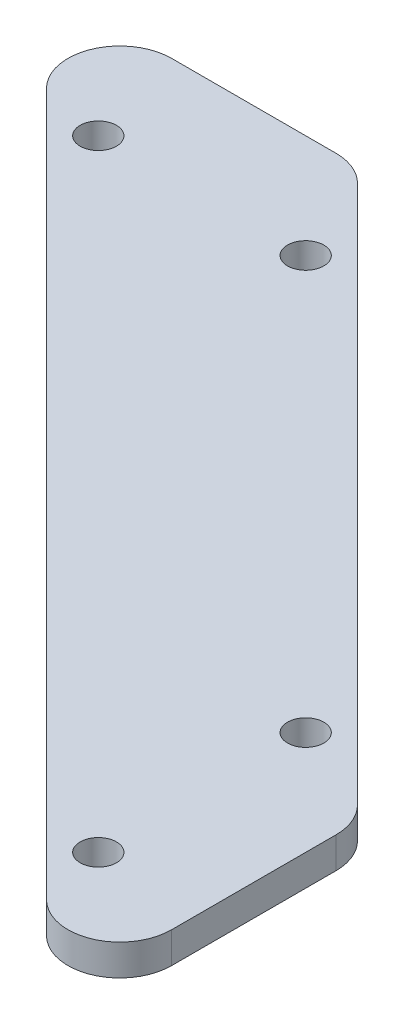
ISO-10303-21;
HEADER;
FILE_DESCRIPTION(('STEP AP214'),'2;1');
FILE_NAME('part.step','',(''),(''),'','','');
FILE_SCHEMA(('AUTOMOTIVE_DESIGN { 1 0 10303 214 1 1 1 1 }'));
ENDSEC;
DATA;
#1=APPLICATION_CONTEXT('core data for automotive mechanical design processes');
#2=APPLICATION_PROTOCOL_DEFINITION('international standard','automotive_design',2000,#1);
#3=PRODUCT_CONTEXT('',#1,'mechanical');
#4=PRODUCT('Part','Part','',(#3));
#5=PRODUCT_RELATED_PRODUCT_CATEGORY('part','',(#4));
#6=PRODUCT_DEFINITION_FORMATION('','',#4);
#7=PRODUCT_DEFINITION_CONTEXT('part definition',#1,'design');
#8=PRODUCT_DEFINITION('design','',#6,#7);
#9=PRODUCT_DEFINITION_SHAPE('','',#8);
#10=(LENGTH_UNIT() NAMED_UNIT(*) SI_UNIT(.MILLI.,.METRE.));
#11=(NAMED_UNIT(*) PLANE_ANGLE_UNIT() SI_UNIT($,.RADIAN.));
#12=(NAMED_UNIT(*) SI_UNIT($,.STERADIAN.) SOLID_ANGLE_UNIT());
#13=UNCERTAINTY_MEASURE_WITH_UNIT(LENGTH_MEASURE(1.E-05),#10,'distance_accuracy_value','');
#14=(GEOMETRIC_REPRESENTATION_CONTEXT(3) GLOBAL_UNCERTAINTY_ASSIGNED_CONTEXT((#13)) GLOBAL_UNIT_ASSIGNED_CONTEXT((#10,
#11,#12)) REPRESENTATION_CONTEXT('',''));
#15=CARTESIAN_POINT('',(0.,0.,0.));
#16=DIRECTION('',(0.,0.,1.));
#17=DIRECTION('',(1.,0.,0.));
#18=AXIS2_PLACEMENT_3D('',#15,#16,#17);
#19=CARTESIAN_POINT('',(0.,3.,-29.9999999999997));
#20=DIRECTION('',(-1.,0.,0.));
#21=DIRECTION('',(0.,0.,1.));
#22=AXIS2_PLACEMENT_3D('',#19,#20,#21);
#23=PLANE('',#22);
#24=DIRECTION('',(0.,0.,-1.));
#25=VECTOR('',#24,1.);
#26=CARTESIAN_POINT('',(0.,3.,-29.9999999999997));
#27=LINE('',#26,#25);
#28=CARTESIAN_POINT('',(0.,3.,-12.0710678118654));
#29=VERTEX_POINT('',#28);
#30=CARTESIAN_POINT('',(0.,3.,-27.9289321881342));
#31=VERTEX_POINT('',#30);
#32=EDGE_CURVE('E117',#29,#31,#27,.T.);
#33=ORIENTED_EDGE('',*,*,#32,.F.);
#34=DIRECTION('',(0.,-1.,0.));
#35=VECTOR('',#34,1.);
#36=CARTESIAN_POINT('',(0.,3.,-12.0710678118654));
#37=LINE('',#36,#35);
#38=CARTESIAN_POINT('',(0.,0.,-12.0710678118654));
#39=VERTEX_POINT('',#38);
#40=EDGE_CURVE('E102',#29,#39,#37,.T.);
#41=ORIENTED_EDGE('',*,*,#40,.T.);
#42=DIRECTION('',(0.,0.,-1.));
#43=VECTOR('',#42,1.);
#44=CARTESIAN_POINT('',(0.,0.,-29.9999999999997));
#45=LINE('',#44,#43);
#46=CARTESIAN_POINT('',(0.,0.,-27.9289321881342));
#47=VERTEX_POINT('',#46);
#48=EDGE_CURVE('E114',#39,#47,#45,.T.);
#49=ORIENTED_EDGE('',*,*,#48,.T.);
#50=DIRECTION('',(0.,-1.,0.));
#51=VECTOR('',#50,1.);
#52=CARTESIAN_POINT('',(0.,3.,-27.9289321881342));
#53=LINE('',#52,#51);
#54=EDGE_CURVE('E119',#47,#31,#53,.F.);
#55=ORIENTED_EDGE('',*,*,#54,.T.);
#56=EDGE_LOOP('',(#33,#41,#49,#55));
#57=FACE_BOUND('',#56,.T.);
#58=ADVANCED_FACE('F32',(#57),#23,.F.);
#59=CARTESIAN_POINT('',(-54.8528137423862,3.,-84.8528137423852));
#60=DIRECTION('',(-0.707106781186543,0.,0.707106781186552));
#61=DIRECTION('',(0.707106781186552,0.,0.707106781186543));
#62=AXIS2_PLACEMENT_3D('',#59,#60,#61);
#63=PLANE('',#62);
#64=DIRECTION('',(-0.707106781186551,0.,-0.707106781186543));
#65=VECTOR('',#64,1.);
#66=CARTESIAN_POINT('',(-54.8528137423862,3.,-84.8528137423852));
#67=LINE('',#66,#65);
#68=CARTESIAN_POINT('',(-1.4644660940673,3.,-31.464466094067));
#69=VERTEX_POINT('',#68);
#70=CARTESIAN_POINT('',(-53.3883476483189,3.,-83.388347648318));
#71=VERTEX_POINT('',#70);
#72=EDGE_CURVE('E163',#69,#71,#67,.T.);
#73=ORIENTED_EDGE('',*,*,#72,.F.);
#74=DIRECTION('',(0.,-1.,0.));
#75=VECTOR('',#74,1.);
#76=CARTESIAN_POINT('',(-1.46446609406729,3.,-31.464466094067));
#77=LINE('',#76,#75);
#78=CARTESIAN_POINT('',(-1.4644660940673,0.,-31.464466094067));
#79=VERTEX_POINT('',#78);
#80=EDGE_CURVE('E156',#69,#79,#77,.T.);
#81=ORIENTED_EDGE('',*,*,#80,.T.);
#82=DIRECTION('',(-0.707106781186551,0.,-0.707106781186543));
#83=VECTOR('',#82,1.);
#84=CARTESIAN_POINT('',(-54.8528137423862,0.,-84.8528137423852));
#85=LINE('',#84,#83);
#86=CARTESIAN_POINT('',(-53.3883476483189,0.,-83.388347648318));
#87=VERTEX_POINT('',#86);
#88=EDGE_CURVE('E123',#79,#87,#85,.T.);
#89=ORIENTED_EDGE('',*,*,#88,.T.);
#90=DIRECTION('',(0.,-1.,0.));
#91=VECTOR('',#90,1.);
#92=CARTESIAN_POINT('',(-53.3883476483189,3.,-83.388347648318));
#93=LINE('',#92,#91);
#94=EDGE_CURVE('E154',#87,#71,#93,.F.);
#95=ORIENTED_EDGE('',*,*,#94,.T.);
#96=EDGE_LOOP('',(#73,#81,#89,#95));
#97=FACE_BOUND('',#96,.T.);
#98=ADVANCED_FACE('F161',(#97),#63,.F.);
#99=CARTESIAN_POINT('',(-84.8528137423861,3.,-84.8528137423852));
#100=DIRECTION('',(0.,0.,1.));
#101=DIRECTION('',(1.,0.,0.));
#102=AXIS2_PLACEMENT_3D('',#99,#100,#101);
#103=PLANE('',#102);
#104=DIRECTION('',(-1.,0.,0.));
#105=VECTOR('',#104,1.);
#106=CARTESIAN_POINT('',(-84.8528137423861,3.,-84.8528137423852));
#107=LINE('',#106,#105);
#108=CARTESIAN_POINT('',(-56.9238815542516,3.,-84.8528137423852));
#109=VERTEX_POINT('',#108);
#110=CARTESIAN_POINT('',(-72.7817459305206,3.,-84.8528137423852));
#111=VERTEX_POINT('',#110);
#112=EDGE_CURVE('E171',#109,#111,#107,.T.);
#113=ORIENTED_EDGE('',*,*,#112,.F.);
#114=DIRECTION('',(0.,-1.,0.));
#115=VECTOR('',#114,1.);
#116=CARTESIAN_POINT('',(-56.9238815542516,3.,-84.8528137423852));
#117=LINE('',#116,#115);
#118=CARTESIAN_POINT('',(-56.9238815542516,0.,-84.8528137423852));
#119=VERTEX_POINT('',#118);
#120=EDGE_CURVE('E11',#109,#119,#117,.T.);
#121=ORIENTED_EDGE('',*,*,#120,.T.);
#122=DIRECTION('',(-1.,0.,0.));
#123=VECTOR('',#122,1.);
#124=CARTESIAN_POINT('',(-84.8528137423861,0.,-84.8528137423852));
#125=LINE('',#124,#123);
#126=CARTESIAN_POINT('',(-72.7817459305206,0.,-84.8528137423852));
#127=VERTEX_POINT('',#126);
#128=EDGE_CURVE('E127',#119,#127,#125,.T.);
#129=ORIENTED_EDGE('',*,*,#128,.T.);
#130=DIRECTION('',(0.,-1.,0.));
#131=VECTOR('',#130,1.);
#132=CARTESIAN_POINT('',(-72.7817459305206,3.,-84.8528137423852));
#133=LINE('',#132,#131);
#134=EDGE_CURVE('E40',#127,#111,#133,.F.);
#135=ORIENTED_EDGE('',*,*,#134,.T.);
#136=EDGE_LOOP('',(#113,#121,#129,#135));
#137=FACE_BOUND('',#136,.T.);
#138=ADVANCED_FACE('F170',(#137),#103,.F.);
#139=CARTESIAN_POINT('',(0.,3.,0.));
#140=DIRECTION('',(0.707106781186544,0.,-0.707106781186551));
#141=DIRECTION('',(-0.707106781186551,0.,-0.707106781186544));
#142=AXIS2_PLACEMENT_3D('',#139,#140,#141);
#143=PLANE('',#142);
#144=DIRECTION('',(0.707106781186551,0.,0.707106781186544));
#145=VECTOR('',#144,1.);
#146=CARTESIAN_POINT('',(0.,0.,0.));
#147=LINE('',#146,#145);
#148=CARTESIAN_POINT('',(-76.3172798364533,0.,-76.3172798364525));
#149=VERTEX_POINT('',#148);
#150=CARTESIAN_POINT('',(-8.53553390593272,0.,-8.53553390593263));
#151=VERTEX_POINT('',#150);
#152=EDGE_CURVE('E137',#149,#151,#147,.T.);
#153=ORIENTED_EDGE('',*,*,#152,.T.);
#154=DIRECTION('',(0.,-1.,0.));
#155=VECTOR('',#154,1.);
#156=CARTESIAN_POINT('',(-8.53553390593272,3.,-8.53553390593263));
#157=LINE('',#156,#155);
#158=CARTESIAN_POINT('',(-8.53553390593272,3.,-8.53553390593263));
#159=VERTEX_POINT('',#158);
#160=EDGE_CURVE('E103',#151,#159,#157,.F.);
#161=ORIENTED_EDGE('',*,*,#160,.T.);
#162=DIRECTION('',(0.707106781186551,0.,0.707106781186544));
#163=VECTOR('',#162,1.);
#164=CARTESIAN_POINT('',(0.,3.,0.));
#165=LINE('',#164,#163);
#166=CARTESIAN_POINT('',(-76.3172798364533,3.,-76.3172798364525));
#167=VERTEX_POINT('',#166);
#168=EDGE_CURVE('E133',#167,#159,#165,.T.);
#169=ORIENTED_EDGE('',*,*,#168,.F.);
#170=DIRECTION('',(0.,-1.,0.));
#171=VECTOR('',#170,1.);
#172=CARTESIAN_POINT('',(-76.3172798364533,3.,-76.3172798364525));
#173=LINE('',#172,#171);
#174=EDGE_CURVE('E108',#167,#149,#173,.T.);
#175=ORIENTED_EDGE('',*,*,#174,.T.);
#176=EDGE_LOOP('',(#153,#161,#169,#175));
#177=FACE_BOUND('',#176,.T.);
#178=ADVANCED_FACE('F203',(#177),#143,.F.);
#179=CARTESIAN_POINT('',(0.,3.,0.));
#180=DIRECTION('',(0.,1.,0.));
#181=DIRECTION('',(0.,0.,1.));
#182=AXIS2_PLACEMENT_3D('',#179,#180,#181);
#183=PLANE('',#182);
#184=CARTESIAN_POINT('',(-69.852813742386,3.,-74.8528137423852));
#185=DIRECTION('',(0.,1.,0.));
#186=DIRECTION('',(0.,0.,1.));
#187=AXIS2_PLACEMENT_3D('',#184,#185,#186);
#188=CIRCLE('',#187,1.74999999999999);
#189=CARTESIAN_POINT('',(-69.852813742386,3.,-73.1028137423853));
#190=VERTEX_POINT('',#189);
#191=EDGE_CURVE('E130',#190,#190,#188,.T.);
#192=ORIENTED_EDGE('',*,*,#191,.F.);
#193=EDGE_LOOP('',(#192));
#194=FACE_BOUND('',#193,.T.);
#195=CARTESIAN_POINT('',(-10.0000000000007,3.,-34.9999999999999));
#196=DIRECTION('',(0.,1.,0.));
#197=DIRECTION('',(0.,0.,1.));
#198=AXIS2_PLACEMENT_3D('',#195,#196,#197);
#199=CIRCLE('',#198,1.75000000000034);
#200=CARTESIAN_POINT('',(-10.0000000000007,3.,-33.2499999999995));
#201=VERTEX_POINT('',#200);
#202=EDGE_CURVE('E190',#201,#201,#199,.T.);
#203=ORIENTED_EDGE('',*,*,#202,.F.);
#204=EDGE_LOOP('',(#203));
#205=FACE_BOUND('',#204,.T.);
#206=CARTESIAN_POINT('',(-10.,3.,-14.9999999999999));
#207=DIRECTION('',(0.,1.,0.));
#208=DIRECTION('',(0.,0.,1.));
#209=AXIS2_PLACEMENT_3D('',#206,#207,#208);
#210=CIRCLE('',#209,1.75);
#211=CARTESIAN_POINT('',(-10.,3.,-13.2499999999999));
#212=VERTEX_POINT('',#211);
#213=EDGE_CURVE('E177',#212,#212,#210,.T.);
#214=ORIENTED_EDGE('',*,*,#213,.F.);
#215=EDGE_LOOP('',(#214));
#216=FACE_BOUND('',#215,.T.);
#217=CARTESIAN_POINT('',(-49.852813742386,3.,-74.8528137423852));
#218=DIRECTION('',(0.,1.,0.));
#219=DIRECTION('',(0.,0.,1.));
#220=AXIS2_PLACEMENT_3D('',#217,#218,#219);
#221=CIRCLE('',#220,1.75);
#222=CARTESIAN_POINT('',(-49.852813742386,3.,-73.1028137423852));
#223=VERTEX_POINT('',#222);
#224=EDGE_CURVE('E184',#223,#223,#221,.T.);
#225=ORIENTED_EDGE('',*,*,#224,.F.);
#226=EDGE_LOOP('',(#225));
#227=FACE_BOUND('',#226,.T.);
#228=ORIENTED_EDGE('',*,*,#168,.T.);
#229=CARTESIAN_POINT('',(-5.,3.,-12.0710678118654));
#230=DIRECTION('',(0.,1.,0.));
#231=DIRECTION('',(0.,0.,1.));
#232=AXIS2_PLACEMENT_3D('',#229,#230,#231);
#233=CIRCLE('',#232,5.);
#234=EDGE_CURVE('E152',#159,#29,#233,.T.);
#235=ORIENTED_EDGE('',*,*,#234,.T.);
#236=ORIENTED_EDGE('',*,*,#32,.T.);
#237=CARTESIAN_POINT('',(-5.,3.,-27.9289321881342));
#238=DIRECTION('',(0.,1.,0.));
#239=DIRECTION('',(0.,0.,1.));
#240=AXIS2_PLACEMENT_3D('',#237,#238,#239);
#241=CIRCLE('',#240,5.);
#242=EDGE_CURVE('E150',#31,#69,#241,.T.);
#243=ORIENTED_EDGE('',*,*,#242,.T.);
#244=ORIENTED_EDGE('',*,*,#72,.T.);
#245=CARTESIAN_POINT('',(-56.9238815542516,3.,-79.8528137423852));
#246=DIRECTION('',(0.,1.,0.));
#247=DIRECTION('',(0.,0.,1.));
#248=AXIS2_PLACEMENT_3D('',#245,#246,#247);
#249=CIRCLE('',#248,5.);
#250=EDGE_CURVE('E53',#71,#109,#249,.T.);
#251=ORIENTED_EDGE('',*,*,#250,.T.);
#252=ORIENTED_EDGE('',*,*,#112,.T.);
#253=CARTESIAN_POINT('',(-72.7817459305206,3.,-79.8528137423852));
#254=DIRECTION('',(0.,1.,0.));
#255=DIRECTION('',(0.,0.,1.));
#256=AXIS2_PLACEMENT_3D('',#253,#254,#255);
#257=CIRCLE('',#256,5.);
#258=EDGE_CURVE('E147',#111,#167,#257,.T.);
#259=ORIENTED_EDGE('',*,*,#258,.T.);
#260=EDGE_LOOP('',(#228,#235,#236,#243,#244,#251,#252,#259));
#261=FACE_BOUND('',#260,.T.);
#262=ADVANCED_FACE('F200',(#194,#205,#216,#227,#261),#183,.T.);
#263=CARTESIAN_POINT('',(0.,0.,0.));
#264=DIRECTION('',(0.,1.,0.));
#265=DIRECTION('',(0.,0.,1.));
#266=AXIS2_PLACEMENT_3D('',#263,#264,#265);
#267=PLANE('',#266);
#268=CARTESIAN_POINT('',(-69.852813742386,0.,-74.8528137423852));
#269=DIRECTION('',(0.,1.,0.));
#270=DIRECTION('',(0.,0.,1.));
#271=AXIS2_PLACEMENT_3D('',#268,#269,#270);
#272=CIRCLE('',#271,1.74999999999999);
#273=CARTESIAN_POINT('',(-69.852813742386,0.,-73.1028137423853));
#274=VERTEX_POINT('',#273);
#275=EDGE_CURVE('E124',#274,#274,#272,.T.);
#276=ORIENTED_EDGE('',*,*,#275,.T.);
#277=EDGE_LOOP('',(#276));
#278=FACE_BOUND('',#277,.T.);
#279=CARTESIAN_POINT('',(-10.0000000000007,0.,-34.9999999999999));
#280=DIRECTION('',(0.,1.,0.));
#281=DIRECTION('',(0.,0.,1.));
#282=AXIS2_PLACEMENT_3D('',#279,#280,#281);
#283=CIRCLE('',#282,1.75000000000034);
#284=CARTESIAN_POINT('',(-10.0000000000007,0.,-33.2499999999995));
#285=VERTEX_POINT('',#284);
#286=EDGE_CURVE('E181',#285,#285,#283,.T.);
#287=ORIENTED_EDGE('',*,*,#286,.T.);
#288=EDGE_LOOP('',(#287));
#289=FACE_BOUND('',#288,.T.);
#290=CARTESIAN_POINT('',(-10.,0.,-14.9999999999999));
#291=DIRECTION('',(0.,1.,0.));
#292=DIRECTION('',(0.,0.,1.));
#293=AXIS2_PLACEMENT_3D('',#290,#291,#292);
#294=CIRCLE('',#293,1.75);
#295=CARTESIAN_POINT('',(-10.,0.,-13.2499999999999));
#296=VERTEX_POINT('',#295);
#297=EDGE_CURVE('E180',#296,#296,#294,.T.);
#298=ORIENTED_EDGE('',*,*,#297,.T.);
#299=EDGE_LOOP('',(#298));
#300=FACE_BOUND('',#299,.T.);
#301=CARTESIAN_POINT('',(-49.852813742386,0.,-74.8528137423852));
#302=DIRECTION('',(0.,1.,0.));
#303=DIRECTION('',(0.,0.,1.));
#304=AXIS2_PLACEMENT_3D('',#301,#302,#303);
#305=CIRCLE('',#304,1.75);
#306=CARTESIAN_POINT('',(-49.852813742386,0.,-73.1028137423852));
#307=VERTEX_POINT('',#306);
#308=EDGE_CURVE('E187',#307,#307,#305,.T.);
#309=ORIENTED_EDGE('',*,*,#308,.T.);
#310=EDGE_LOOP('',(#309));
#311=FACE_BOUND('',#310,.T.);
#312=ORIENTED_EDGE('',*,*,#48,.F.);
#313=CARTESIAN_POINT('',(-5.,0.,-12.0710678118654));
#314=DIRECTION('',(0.,1.,0.));
#315=DIRECTION('',(0.,0.,1.));
#316=AXIS2_PLACEMENT_3D('',#313,#314,#315);
#317=CIRCLE('',#316,5.);
#318=EDGE_CURVE('E98',#39,#151,#317,.F.);
#319=ORIENTED_EDGE('',*,*,#318,.T.);
#320=ORIENTED_EDGE('',*,*,#152,.F.);
#321=CARTESIAN_POINT('',(-72.7817459305206,0.,-79.8528137423852));
#322=DIRECTION('',(0.,1.,0.));
#323=DIRECTION('',(0.,0.,1.));
#324=AXIS2_PLACEMENT_3D('',#321,#322,#323);
#325=CIRCLE('',#324,5.);
#326=EDGE_CURVE('E118',#149,#127,#325,.F.);
#327=ORIENTED_EDGE('',*,*,#326,.T.);
#328=ORIENTED_EDGE('',*,*,#128,.F.);
#329=CARTESIAN_POINT('',(-56.9238815542516,0.,-79.8528137423852));
#330=DIRECTION('',(0.,1.,0.));
#331=DIRECTION('',(0.,0.,1.));
#332=AXIS2_PLACEMENT_3D('',#329,#330,#331);
#333=CIRCLE('',#332,5.);
#334=EDGE_CURVE('E141',#119,#87,#333,.F.);
#335=ORIENTED_EDGE('',*,*,#334,.T.);
#336=ORIENTED_EDGE('',*,*,#88,.F.);
#337=CARTESIAN_POINT('',(-5.,0.,-27.9289321881342));
#338=DIRECTION('',(0.,1.,0.));
#339=DIRECTION('',(0.,0.,1.));
#340=AXIS2_PLACEMENT_3D('',#337,#338,#339);
#341=CIRCLE('',#340,5.);
#342=EDGE_CURVE('E109',#79,#47,#341,.F.);
#343=ORIENTED_EDGE('',*,*,#342,.T.);
#344=EDGE_LOOP('',(#312,#319,#320,#327,#328,#335,#336,#343));
#345=FACE_BOUND('',#344,.T.);
#346=ADVANCED_FACE('F121',(#278,#289,#300,#311,#345),#267,.F.);
#347=CARTESIAN_POINT('',(-49.852813742386,0.,-74.8528137423852));
#348=DIRECTION('',(0.,1.,0.));
#349=DIRECTION('',(0.,0.,1.));
#350=AXIS2_PLACEMENT_3D('',#347,#348,#349);
#351=CYLINDRICAL_SURFACE('',#350,1.75);
#352=ORIENTED_EDGE('',*,*,#308,.F.);
#353=EDGE_LOOP('',(#352));
#354=FACE_BOUND('',#353,.T.);
#355=ORIENTED_EDGE('',*,*,#224,.T.);
#356=EDGE_LOOP('',(#355));
#357=FACE_BOUND('',#356,.T.);
#358=ADVANCED_FACE('F277',(#354,#357),#351,.F.);
#359=CARTESIAN_POINT('',(-10.,0.,-14.9999999999999));
#360=DIRECTION('',(0.,1.,0.));
#361=DIRECTION('',(0.,0.,1.));
#362=AXIS2_PLACEMENT_3D('',#359,#360,#361);
#363=CYLINDRICAL_SURFACE('',#362,1.75);
#364=ORIENTED_EDGE('',*,*,#297,.F.);
#365=EDGE_LOOP('',(#364));
#366=FACE_BOUND('',#365,.T.);
#367=ORIENTED_EDGE('',*,*,#213,.T.);
#368=EDGE_LOOP('',(#367));
#369=FACE_BOUND('',#368,.T.);
#370=ADVANCED_FACE('F268',(#366,#369),#363,.F.);
#371=CARTESIAN_POINT('',(-10.0000000000007,0.,-34.9999999999999));
#372=DIRECTION('',(0.,1.,0.));
#373=DIRECTION('',(0.,0.,1.));
#374=AXIS2_PLACEMENT_3D('',#371,#372,#373);
#375=CYLINDRICAL_SURFACE('',#374,1.75000000000034);
#376=ORIENTED_EDGE('',*,*,#286,.F.);
#377=EDGE_LOOP('',(#376));
#378=FACE_BOUND('',#377,.T.);
#379=ORIENTED_EDGE('',*,*,#202,.T.);
#380=EDGE_LOOP('',(#379));
#381=FACE_BOUND('',#380,.T.);
#382=ADVANCED_FACE('F259',(#378,#381),#375,.F.);
#383=CARTESIAN_POINT('',(-69.852813742386,0.,-74.8528137423852));
#384=DIRECTION('',(0.,1.,0.));
#385=DIRECTION('',(0.,0.,1.));
#386=AXIS2_PLACEMENT_3D('',#383,#384,#385);
#387=CYLINDRICAL_SURFACE('',#386,1.74999999999999);
#388=ORIENTED_EDGE('',*,*,#275,.F.);
#389=EDGE_LOOP('',(#388));
#390=FACE_BOUND('',#389,.T.);
#391=ORIENTED_EDGE('',*,*,#191,.T.);
#392=EDGE_LOOP('',(#391));
#393=FACE_BOUND('',#392,.T.);
#394=ADVANCED_FACE('F198',(#390,#393),#387,.F.);
#395=CARTESIAN_POINT('',(-5.,3.,-12.0710678118654));
#396=DIRECTION('',(0.,-1.,0.));
#397=DIRECTION('',(0.,0.,-1.));
#398=AXIS2_PLACEMENT_3D('',#395,#396,#397);
#399=CYLINDRICAL_SURFACE('',#398,5.);
#400=ORIENTED_EDGE('',*,*,#234,.F.);
#401=ORIENTED_EDGE('',*,*,#160,.F.);
#402=ORIENTED_EDGE('',*,*,#318,.F.);
#403=ORIENTED_EDGE('',*,*,#40,.F.);
#404=EDGE_LOOP('',(#400,#401,#402,#403));
#405=FACE_BOUND('',#404,.T.);
#406=ADVANCED_FACE('F101',(#405),#399,.T.);
#407=CARTESIAN_POINT('',(-5.,3.,-27.9289321881342));
#408=DIRECTION('',(0.,-1.,0.));
#409=DIRECTION('',(0.,0.,-1.));
#410=AXIS2_PLACEMENT_3D('',#407,#408,#409);
#411=CYLINDRICAL_SURFACE('',#410,5.);
#412=ORIENTED_EDGE('',*,*,#242,.F.);
#413=ORIENTED_EDGE('',*,*,#54,.F.);
#414=ORIENTED_EDGE('',*,*,#342,.F.);
#415=ORIENTED_EDGE('',*,*,#80,.F.);
#416=EDGE_LOOP('',(#412,#413,#414,#415));
#417=FACE_BOUND('',#416,.T.);
#418=ADVANCED_FACE('F218',(#417),#411,.T.);
#419=CARTESIAN_POINT('',(-56.9238815542516,3.,-79.8528137423852));
#420=DIRECTION('',(0.,-1.,0.));
#421=DIRECTION('',(0.,0.,-1.));
#422=AXIS2_PLACEMENT_3D('',#419,#420,#421);
#423=CYLINDRICAL_SURFACE('',#422,5.);
#424=ORIENTED_EDGE('',*,*,#250,.F.);
#425=ORIENTED_EDGE('',*,*,#94,.F.);
#426=ORIENTED_EDGE('',*,*,#334,.F.);
#427=ORIENTED_EDGE('',*,*,#120,.F.);
#428=EDGE_LOOP('',(#424,#425,#426,#427));
#429=FACE_BOUND('',#428,.T.);
#430=ADVANCED_FACE('F169',(#429),#423,.T.);
#431=CARTESIAN_POINT('',(-72.7817459305206,3.,-79.8528137423852));
#432=DIRECTION('',(0.,-1.,0.));
#433=DIRECTION('',(0.,0.,-1.));
#434=AXIS2_PLACEMENT_3D('',#431,#432,#433);
#435=CYLINDRICAL_SURFACE('',#434,5.);
#436=ORIENTED_EDGE('',*,*,#258,.F.);
#437=ORIENTED_EDGE('',*,*,#134,.F.);
#438=ORIENTED_EDGE('',*,*,#326,.F.);
#439=ORIENTED_EDGE('',*,*,#174,.F.);
#440=EDGE_LOOP('',(#436,#437,#438,#439));
#441=FACE_BOUND('',#440,.T.);
#442=ADVANCED_FACE('F34',(#441),#435,.T.);
#443=CLOSED_SHELL('',(#58,#98,#138,#178,#262,#346,#358,#370,#382,#394,#406,#418,#430,#442));
#444=MANIFOLD_SOLID_BREP('B2',#443);
#445=ADVANCED_BREP_SHAPE_REPRESENTATION('',(#18,#444),#14);
#446=SHAPE_DEFINITION_REPRESENTATION(#9,#445);
ENDSEC;
END-ISO-10303-21;
